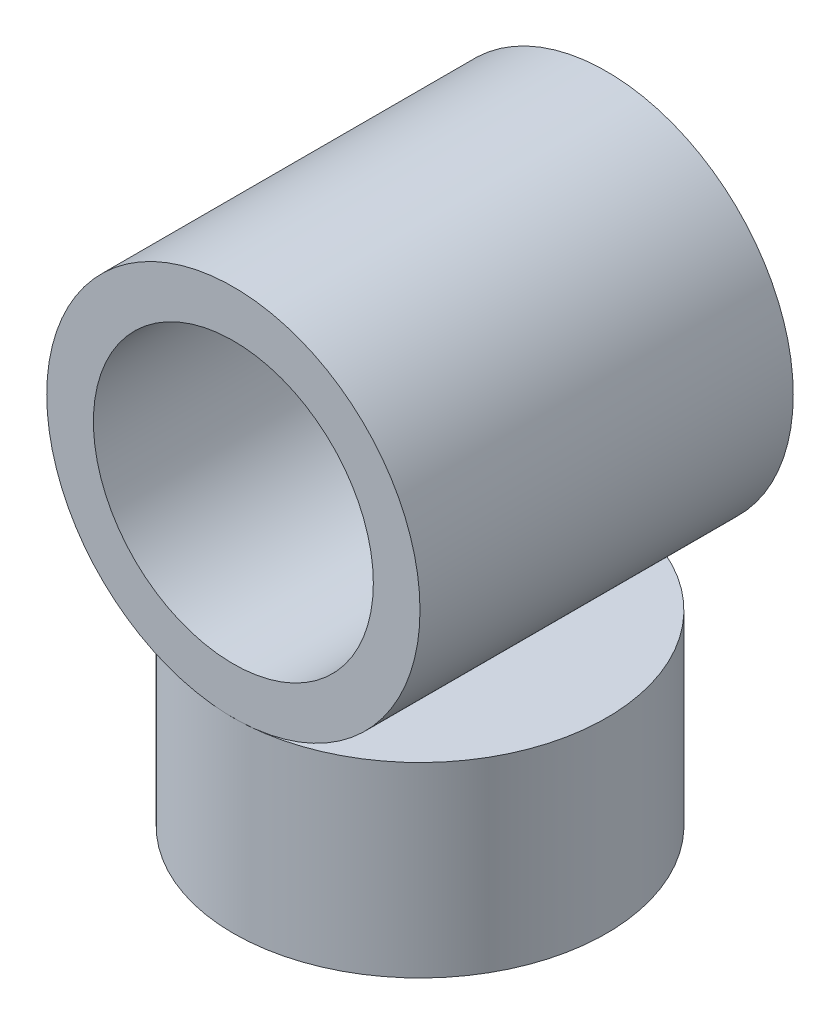
ISO-10303-21;
HEADER;
FILE_DESCRIPTION(('STEP AP214'),'2;1');
FILE_NAME('part.step','',(''),(''),'','','');
FILE_SCHEMA(('AUTOMOTIVE_DESIGN { 1 0 10303 214 1 1 1 1 }'));
ENDSEC;
DATA;
#1=APPLICATION_CONTEXT('core data for automotive mechanical design processes');
#2=APPLICATION_PROTOCOL_DEFINITION('international standard','automotive_design',2000,#1);
#3=PRODUCT_CONTEXT('',#1,'mechanical');
#4=PRODUCT('Part','Part','',(#3));
#5=PRODUCT_RELATED_PRODUCT_CATEGORY('part','',(#4));
#6=PRODUCT_DEFINITION_FORMATION('','',#4);
#7=PRODUCT_DEFINITION_CONTEXT('part definition',#1,'design');
#8=PRODUCT_DEFINITION('design','',#6,#7);
#9=PRODUCT_DEFINITION_SHAPE('','',#8);
#10=(LENGTH_UNIT() NAMED_UNIT(*) SI_UNIT(.MILLI.,.METRE.));
#11=(NAMED_UNIT(*) PLANE_ANGLE_UNIT() SI_UNIT($,.RADIAN.));
#12=(NAMED_UNIT(*) SI_UNIT($,.STERADIAN.) SOLID_ANGLE_UNIT());
#13=UNCERTAINTY_MEASURE_WITH_UNIT(LENGTH_MEASURE(1.E-05),#10,'distance_accuracy_value','');
#14=(GEOMETRIC_REPRESENTATION_CONTEXT(3) GLOBAL_UNCERTAINTY_ASSIGNED_CONTEXT((#13)) GLOBAL_UNIT_ASSIGNED_CONTEXT((#10,
#11,#12)) REPRESENTATION_CONTEXT('',''));
#15=CARTESIAN_POINT('',(0.,0.,0.));
#16=DIRECTION('',(0.,0.,1.));
#17=DIRECTION('',(1.,0.,0.));
#18=AXIS2_PLACEMENT_3D('',#15,#16,#17);
#19=CARTESIAN_POINT('',(0.,10.,10.));
#20=DIRECTION('',(0.,0.,-1.));
#21=DIRECTION('',(-1.,0.,0.));
#22=AXIS2_PLACEMENT_3D('',#19,#20,#21);
#23=CYLINDRICAL_SURFACE('',#22,10.);
#24=CARTESIAN_POINT('',(0.,10.,10.));
#25=DIRECTION('',(0.,0.,1.));
#26=DIRECTION('',(1.,0.,0.));
#27=AXIS2_PLACEMENT_3D('',#24,#25,#26);
#28=CIRCLE('',#27,10.);
#29=CARTESIAN_POINT('',(10.,10.,10.));
#30=VERTEX_POINT('',#29);
#31=EDGE_CURVE('E11',#30,#30,#28,.T.);
#32=ORIENTED_EDGE('',*,*,#31,.F.);
#33=EDGE_LOOP('',(#32));
#34=FACE_BOUND('',#33,.T.);
#35=CARTESIAN_POINT('',(0.,10.,-10.));
#36=DIRECTION('',(0.,0.,1.));
#37=DIRECTION('',(1.,0.,0.));
#38=AXIS2_PLACEMENT_3D('',#35,#36,#37);
#39=CIRCLE('',#38,10.);
#40=CARTESIAN_POINT('',(10.,10.,-10.));
#41=VERTEX_POINT('',#40);
#42=EDGE_CURVE('E48',#41,#41,#39,.T.);
#43=ORIENTED_EDGE('',*,*,#42,.T.);
#44=EDGE_LOOP('',(#43));
#45=FACE_BOUND('',#44,.T.);
#46=ADVANCED_FACE('F45',(#34,#45),#23,.T.);
#47=CARTESIAN_POINT('',(0.,10.,10.));
#48=DIRECTION('',(0.,0.,1.));
#49=DIRECTION('',(1.,0.,0.));
#50=AXIS2_PLACEMENT_3D('',#47,#48,#49);
#51=PLANE('',#50);
#52=CARTESIAN_POINT('',(0.,10.,10.));
#53=DIRECTION('',(0.,0.,1.));
#54=DIRECTION('',(1.,0.,0.));
#55=AXIS2_PLACEMENT_3D('',#52,#53,#54);
#56=CIRCLE('',#55,7.5);
#57=CARTESIAN_POINT('',(7.5,10.,10.));
#58=VERTEX_POINT('',#57);
#59=EDGE_CURVE('E62',#58,#58,#56,.T.);
#60=ORIENTED_EDGE('',*,*,#59,.F.);
#61=EDGE_LOOP('',(#60));
#62=FACE_BOUND('',#61,.T.);
#63=ORIENTED_EDGE('',*,*,#31,.T.);
#64=EDGE_LOOP('',(#63));
#65=FACE_BOUND('',#64,.T.);
#66=ADVANCED_FACE('F70',(#62,#65),#51,.T.);
#67=CARTESIAN_POINT('',(0.,10.,-10.));
#68=DIRECTION('',(0.,0.,1.));
#69=DIRECTION('',(1.,0.,0.));
#70=AXIS2_PLACEMENT_3D('',#67,#68,#69);
#71=PLANE('',#70);
#72=CARTESIAN_POINT('',(0.,10.,-10.));
#73=DIRECTION('',(0.,0.,1.));
#74=DIRECTION('',(1.,0.,0.));
#75=AXIS2_PLACEMENT_3D('',#72,#73,#74);
#76=CIRCLE('',#75,7.5);
#77=CARTESIAN_POINT('',(7.5,10.,-10.));
#78=VERTEX_POINT('',#77);
#79=EDGE_CURVE('E57',#78,#78,#76,.F.);
#80=ORIENTED_EDGE('',*,*,#79,.F.);
#81=EDGE_LOOP('',(#80));
#82=FACE_BOUND('',#81,.T.);
#83=ORIENTED_EDGE('',*,*,#42,.F.);
#84=EDGE_LOOP('',(#83));
#85=FACE_BOUND('',#84,.T.);
#86=ADVANCED_FACE('F72',(#82,#85),#71,.F.);
#87=CARTESIAN_POINT('',(0.,10.,-10.001));
#88=DIRECTION('',(0.,0.,1.));
#89=DIRECTION('',(1.,0.,0.));
#90=AXIS2_PLACEMENT_3D('',#87,#88,#89);
#91=CYLINDRICAL_SURFACE('',#90,7.5);
#92=ORIENTED_EDGE('',*,*,#59,.T.);
#93=EDGE_LOOP('',(#92));
#94=FACE_BOUND('',#93,.T.);
#95=ORIENTED_EDGE('',*,*,#79,.T.);
#96=EDGE_LOOP('',(#95));
#97=FACE_BOUND('',#96,.T.);
#98=ADVANCED_FACE('F67',(#94,#97),#91,.F.);
#99=CLOSED_SHELL('',(#46,#66,#86,#98));
#100=MANIFOLD_SOLID_BREP('B2',#99);
#101=CARTESIAN_POINT('',(0.,-10.,0.));
#102=DIRECTION('',(0.,1.,0.));
#103=DIRECTION('',(0.,0.,1.));
#104=AXIS2_PLACEMENT_3D('',#101,#102,#103);
#105=CYLINDRICAL_SURFACE('',#104,10.);
#106=CARTESIAN_POINT('',(0.,-10.,0.));
#107=DIRECTION('',(0.,1.,0.));
#108=DIRECTION('',(0.,0.,1.));
#109=AXIS2_PLACEMENT_3D('',#106,#107,#108);
#110=CIRCLE('',#109,10.);
#111=CARTESIAN_POINT('',(0.,-10.,10.));
#112=VERTEX_POINT('',#111);
#113=EDGE_CURVE('E44',#112,#112,#110,.T.);
#114=ORIENTED_EDGE('',*,*,#113,.T.);
#115=EDGE_LOOP('',(#114));
#116=FACE_BOUND('',#115,.T.);
#117=CARTESIAN_POINT('',(0.,0.,0.));
#118=DIRECTION('',(0.,1.,0.));
#119=DIRECTION('',(0.,0.,1.));
#120=AXIS2_PLACEMENT_3D('',#117,#118,#119);
#121=CIRCLE('',#120,10.);
#122=CARTESIAN_POINT('',(0.,0.,10.));
#123=VERTEX_POINT('',#122);
#124=EDGE_CURVE('E114',#123,#123,#121,.T.);
#125=ORIENTED_EDGE('',*,*,#124,.F.);
#126=EDGE_LOOP('',(#125));
#127=FACE_BOUND('',#126,.T.);
#128=ADVANCED_FACE('F111',(#116,#127),#105,.T.);
#129=CARTESIAN_POINT('',(0.,-10.,0.));
#130=DIRECTION('',(0.,1.,0.));
#131=DIRECTION('',(0.,0.,1.));
#132=AXIS2_PLACEMENT_3D('',#129,#130,#131);
#133=PLANE('',#132);
#134=CARTESIAN_POINT('',(0.,-10.,0.));
#135=DIRECTION('',(0.,-1.,0.));
#136=DIRECTION('',(0.,0.,-1.));
#137=AXIS2_PLACEMENT_3D('',#134,#135,#136);
#138=CIRCLE('',#137,7.5);
#139=CARTESIAN_POINT('',(0.,-10.,-7.5));
#140=VERTEX_POINT('',#139);
#141=EDGE_CURVE('E123',#140,#140,#138,.T.);
#142=ORIENTED_EDGE('',*,*,#141,.F.);
#143=EDGE_LOOP('',(#142));
#144=FACE_BOUND('',#143,.T.);
#145=ORIENTED_EDGE('',*,*,#113,.F.);
#146=EDGE_LOOP('',(#145));
#147=FACE_BOUND('',#146,.T.);
#148=ADVANCED_FACE('F138',(#144,#147),#133,.F.);
#149=CARTESIAN_POINT('',(0.,0.,0.));
#150=DIRECTION('',(0.,1.,0.));
#151=DIRECTION('',(0.,0.,1.));
#152=AXIS2_PLACEMENT_3D('',#149,#150,#151);
#153=PLANE('',#152);
#154=ORIENTED_EDGE('',*,*,#124,.T.);
#155=EDGE_LOOP('',(#154));
#156=FACE_BOUND('',#155,.T.);
#157=ADVANCED_FACE('F134',(#156),#153,.T.);
#158=CARTESIAN_POINT('',(0.,-5.,0.));
#159=DIRECTION('',(0.,-1.,0.));
#160=DIRECTION('',(0.,0.,-1.));
#161=AXIS2_PLACEMENT_3D('',#158,#159,#160);
#162=CYLINDRICAL_SURFACE('',#161,7.5);
#163=CARTESIAN_POINT('',(0.,-5.,0.));
#164=DIRECTION('',(0.,-1.,0.));
#165=DIRECTION('',(0.,0.,-1.));
#166=AXIS2_PLACEMENT_3D('',#163,#164,#165);
#167=CIRCLE('',#166,7.5);
#168=CARTESIAN_POINT('',(0.,-5.,-7.5));
#169=VERTEX_POINT('',#168);
#170=EDGE_CURVE('E121',#169,#169,#167,.T.);
#171=ORIENTED_EDGE('',*,*,#170,.F.);
#172=EDGE_LOOP('',(#171));
#173=FACE_BOUND('',#172,.T.);
#174=ORIENTED_EDGE('',*,*,#141,.T.);
#175=EDGE_LOOP('',(#174));
#176=FACE_BOUND('',#175,.T.);
#177=ADVANCED_FACE('F131',(#173,#176),#162,.F.);
#178=CARTESIAN_POINT('',(0.,-5.,0.));
#179=DIRECTION('',(0.,-1.,0.));
#180=DIRECTION('',(0.,0.,-1.));
#181=AXIS2_PLACEMENT_3D('',#178,#179,#180);
#182=PLANE('',#181);
#183=ORIENTED_EDGE('',*,*,#170,.T.);
#184=EDGE_LOOP('',(#183));
#185=FACE_BOUND('',#184,.T.);
#186=ADVANCED_FACE('F129',(#185),#182,.T.);
#187=CLOSED_SHELL('',(#128,#148,#157,#177,#186));
#188=MANIFOLD_SOLID_BREP('B6',#187);
#189=ADVANCED_BREP_SHAPE_REPRESENTATION('',(#18,#100,#188),#14);
#190=SHAPE_DEFINITION_REPRESENTATION(#9,#189);
ENDSEC;
END-ISO-10303-21;
